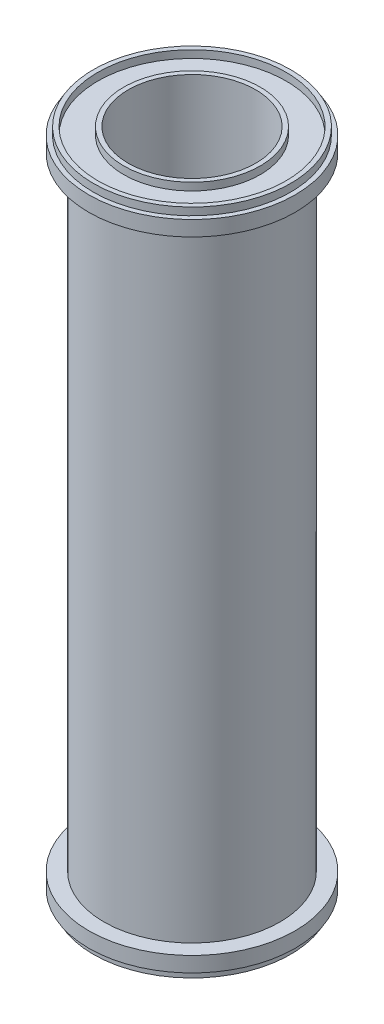
ISO-10303-21;
HEADER;
FILE_DESCRIPTION(('STEP AP214'),'2;1');
FILE_NAME('part.step','',(''),(''),'','','');
FILE_SCHEMA(('AUTOMOTIVE_DESIGN { 1 0 10303 214 1 1 1 1 }'));
ENDSEC;
DATA;
#1=APPLICATION_CONTEXT('core data for automotive mechanical design processes');
#2=APPLICATION_PROTOCOL_DEFINITION('international standard','automotive_design',2000,#1);
#3=PRODUCT_CONTEXT('',#1,'mechanical');
#4=PRODUCT('Part','Part','',(#3));
#5=PRODUCT_RELATED_PRODUCT_CATEGORY('part','',(#4));
#6=PRODUCT_DEFINITION_FORMATION('','',#4);
#7=PRODUCT_DEFINITION_CONTEXT('part definition',#1,'design');
#8=PRODUCT_DEFINITION('design','',#6,#7);
#9=PRODUCT_DEFINITION_SHAPE('','',#8);
#10=(LENGTH_UNIT() NAMED_UNIT(*) SI_UNIT(.MILLI.,.METRE.));
#11=(NAMED_UNIT(*) PLANE_ANGLE_UNIT() SI_UNIT($,.RADIAN.));
#12=(NAMED_UNIT(*) SI_UNIT($,.STERADIAN.) SOLID_ANGLE_UNIT());
#13=UNCERTAINTY_MEASURE_WITH_UNIT(LENGTH_MEASURE(1.E-05),#10,'distance_accuracy_value','');
#14=(GEOMETRIC_REPRESENTATION_CONTEXT(3) GLOBAL_UNCERTAINTY_ASSIGNED_CONTEXT((#13)) GLOBAL_UNIT_ASSIGNED_CONTEXT((#10,
#11,#12)) REPRESENTATION_CONTEXT('',''));
#15=CARTESIAN_POINT('',(0.,0.,0.));
#16=DIRECTION('',(0.,0.,1.));
#17=DIRECTION('',(1.,0.,0.));
#18=AXIS2_PLACEMENT_3D('',#15,#16,#17);
#19=CARTESIAN_POINT('',(0.,0.,0.));
#20=DIRECTION('',(0.,1.,0.));
#21=DIRECTION('',(0.,0.,1.));
#22=AXIS2_PLACEMENT_3D('',#19,#20,#21);
#23=CYLINDRICAL_SURFACE('',#22,4.2);
#24=CARTESIAN_POINT('',(0.,22.,0.));
#25=DIRECTION('',(0.,1.,0.));
#26=DIRECTION('',(0.,0.,1.));
#27=AXIS2_PLACEMENT_3D('',#24,#25,#26);
#28=CIRCLE('',#27,4.2);
#29=CARTESIAN_POINT('',(0.,22.,4.2));
#30=VERTEX_POINT('',#29);
#31=EDGE_CURVE('E95',#30,#30,#28,.T.);
#32=ORIENTED_EDGE('',*,*,#31,.T.);
#33=EDGE_LOOP('',(#32));
#34=FACE_BOUND('',#33,.T.);
#35=CARTESIAN_POINT('',(0.,-22.,0.));
#36=DIRECTION('',(0.,1.,0.));
#37=DIRECTION('',(0.,0.,1.));
#38=AXIS2_PLACEMENT_3D('',#35,#36,#37);
#39=CIRCLE('',#38,4.2);
#40=CARTESIAN_POINT('',(0.,-22.,4.2));
#41=VERTEX_POINT('',#40);
#42=EDGE_CURVE('E10',#41,#41,#39,.T.);
#43=ORIENTED_EDGE('',*,*,#42,.F.);
#44=EDGE_LOOP('',(#43));
#45=FACE_BOUND('',#44,.T.);
#46=ADVANCED_FACE('F31',(#34,#45),#23,.F.);
#47=CARTESIAN_POINT('',(0.,-22.,4.5));
#48=DIRECTION('',(0.,-1.,0.));
#49=DIRECTION('',(0.,0.,-1.));
#50=AXIS2_PLACEMENT_3D('',#47,#48,#49);
#51=PLANE('',#50);
#52=ORIENTED_EDGE('',*,*,#42,.T.);
#53=EDGE_LOOP('',(#52));
#54=FACE_BOUND('',#53,.T.);
#55=CARTESIAN_POINT('',(0.,-22.,0.));
#56=DIRECTION('',(0.,1.,0.));
#57=DIRECTION('',(0.,0.,1.));
#58=AXIS2_PLACEMENT_3D('',#55,#56,#57);
#59=CIRCLE('',#58,4.5);
#60=CARTESIAN_POINT('',(0.,-22.,4.5));
#61=VERTEX_POINT('',#60);
#62=EDGE_CURVE('E37',#61,#61,#59,.T.);
#63=ORIENTED_EDGE('',*,*,#62,.F.);
#64=EDGE_LOOP('',(#63));
#65=FACE_BOUND('',#64,.T.);
#66=ADVANCED_FACE('F113',(#54,#65),#51,.T.);
#67=CARTESIAN_POINT('',(0.,0.,0.));
#68=DIRECTION('',(0.,1.,0.));
#69=DIRECTION('',(0.,0.,1.));
#70=AXIS2_PLACEMENT_3D('',#67,#68,#69);
#71=CYLINDRICAL_SURFACE('',#70,4.5);
#72=ORIENTED_EDGE('',*,*,#62,.T.);
#73=EDGE_LOOP('',(#72));
#74=FACE_BOUND('',#73,.T.);
#75=CARTESIAN_POINT('',(0.,-21.5,0.));
#76=DIRECTION('',(0.,1.,0.));
#77=DIRECTION('',(0.,0.,1.));
#78=AXIS2_PLACEMENT_3D('',#75,#76,#77);
#79=CIRCLE('',#78,4.5);
#80=CARTESIAN_POINT('',(0.,-21.5,4.5));
#81=VERTEX_POINT('',#80);
#82=EDGE_CURVE('E41',#81,#81,#79,.T.);
#83=ORIENTED_EDGE('',*,*,#82,.F.);
#84=EDGE_LOOP('',(#83));
#85=FACE_BOUND('',#84,.T.);
#86=ADVANCED_FACE('F117',(#74,#85),#71,.T.);
#87=CARTESIAN_POINT('',(0.,-21.5,6.2));
#88=DIRECTION('',(0.,-1.,0.));
#89=DIRECTION('',(0.,0.,-1.));
#90=AXIS2_PLACEMENT_3D('',#87,#88,#89);
#91=PLANE('',#90);
#92=ORIENTED_EDGE('',*,*,#82,.T.);
#93=EDGE_LOOP('',(#92));
#94=FACE_BOUND('',#93,.T.);
#95=CARTESIAN_POINT('',(0.,-21.5,0.));
#96=DIRECTION('',(0.,1.,0.));
#97=DIRECTION('',(0.,0.,1.));
#98=AXIS2_PLACEMENT_3D('',#95,#96,#97);
#99=CIRCLE('',#98,6.2);
#100=CARTESIAN_POINT('',(0.,-21.5,6.2));
#101=VERTEX_POINT('',#100);
#102=EDGE_CURVE('E45',#101,#101,#99,.T.);
#103=ORIENTED_EDGE('',*,*,#102,.F.);
#104=EDGE_LOOP('',(#103));
#105=FACE_BOUND('',#104,.T.);
#106=ADVANCED_FACE('F121',(#94,#105),#91,.T.);
#107=CARTESIAN_POINT('',(0.,0.,0.));
#108=DIRECTION('',(0.,1.,0.));
#109=DIRECTION('',(0.,0.,1.));
#110=AXIS2_PLACEMENT_3D('',#107,#108,#109);
#111=CYLINDRICAL_SURFACE('',#110,6.2);
#112=ORIENTED_EDGE('',*,*,#102,.T.);
#113=EDGE_LOOP('',(#112));
#114=FACE_BOUND('',#113,.T.);
#115=CARTESIAN_POINT('',(0.,-22.,0.));
#116=DIRECTION('',(0.,1.,0.));
#117=DIRECTION('',(0.,0.,1.));
#118=AXIS2_PLACEMENT_3D('',#115,#116,#117);
#119=CIRCLE('',#118,6.2);
#120=CARTESIAN_POINT('',(0.,-22.,6.2));
#121=VERTEX_POINT('',#120);
#122=EDGE_CURVE('E50',#121,#121,#119,.T.);
#123=ORIENTED_EDGE('',*,*,#122,.F.);
#124=EDGE_LOOP('',(#123));
#125=FACE_BOUND('',#124,.T.);
#126=ADVANCED_FACE('F127',(#114,#125),#111,.F.);
#127=CARTESIAN_POINT('',(0.,-22.,6.50000000000001));
#128=DIRECTION('',(0.,-1.,0.));
#129=DIRECTION('',(0.,0.,-1.));
#130=AXIS2_PLACEMENT_3D('',#127,#128,#129);
#131=PLANE('',#130);
#132=ORIENTED_EDGE('',*,*,#122,.T.);
#133=EDGE_LOOP('',(#132));
#134=FACE_BOUND('',#133,.T.);
#135=CARTESIAN_POINT('',(0.,-22.,0.));
#136=DIRECTION('',(0.,1.,0.));
#137=DIRECTION('',(0.,0.,1.));
#138=AXIS2_PLACEMENT_3D('',#135,#136,#137);
#139=CIRCLE('',#138,6.5);
#140=CARTESIAN_POINT('',(0.,-22.,6.50000000000001));
#141=VERTEX_POINT('',#140);
#142=EDGE_CURVE('E53',#141,#141,#139,.T.);
#143=ORIENTED_EDGE('',*,*,#142,.F.);
#144=EDGE_LOOP('',(#143));
#145=FACE_BOUND('',#144,.T.);
#146=ADVANCED_FACE('F131',(#134,#145),#131,.T.);
#147=CARTESIAN_POINT('',(0.,0.,0.));
#148=DIRECTION('',(0.,1.,0.));
#149=DIRECTION('',(0.,0.,1.));
#150=AXIS2_PLACEMENT_3D('',#147,#148,#149);
#151=CYLINDRICAL_SURFACE('',#150,6.5);
#152=ORIENTED_EDGE('',*,*,#142,.T.);
#153=EDGE_LOOP('',(#152));
#154=FACE_BOUND('',#153,.T.);
#155=CARTESIAN_POINT('',(0.,-21.5,0.));
#156=DIRECTION('',(0.,1.,0.));
#157=DIRECTION('',(0.,0.,1.));
#158=AXIS2_PLACEMENT_3D('',#155,#156,#157);
#159=CIRCLE('',#158,6.5);
#160=CARTESIAN_POINT('',(0.,-21.5,6.50000000000001));
#161=VERTEX_POINT('',#160);
#162=EDGE_CURVE('E56',#161,#161,#159,.T.);
#163=ORIENTED_EDGE('',*,*,#162,.F.);
#164=EDGE_LOOP('',(#163));
#165=FACE_BOUND('',#164,.T.);
#166=ADVANCED_FACE('F135',(#154,#165),#151,.T.);
#167=CARTESIAN_POINT('',(0.,-21.5,6.8000000000001));
#168=DIRECTION('',(0.,-1.,0.));
#169=DIRECTION('',(0.,0.,-1.));
#170=AXIS2_PLACEMENT_3D('',#167,#168,#169);
#171=PLANE('',#170);
#172=ORIENTED_EDGE('',*,*,#162,.T.);
#173=EDGE_LOOP('',(#172));
#174=FACE_BOUND('',#173,.T.);
#175=CARTESIAN_POINT('',(0.,-21.5,0.));
#176=DIRECTION('',(0.,1.,0.));
#177=DIRECTION('',(0.,0.,1.));
#178=AXIS2_PLACEMENT_3D('',#175,#176,#177);
#179=CIRCLE('',#178,6.8000000000001);
#180=CARTESIAN_POINT('',(0.,-21.5,6.8000000000001));
#181=VERTEX_POINT('',#180);
#182=EDGE_CURVE('E59',#181,#181,#179,.T.);
#183=ORIENTED_EDGE('',*,*,#182,.F.);
#184=EDGE_LOOP('',(#183));
#185=FACE_BOUND('',#184,.T.);
#186=ADVANCED_FACE('F139',(#174,#185),#171,.T.);
#187=CARTESIAN_POINT('',(0.,0.,0.));
#188=DIRECTION('',(0.,1.,0.));
#189=DIRECTION('',(0.,0.,1.));
#190=AXIS2_PLACEMENT_3D('',#187,#188,#189);
#191=CYLINDRICAL_SURFACE('',#190,6.8000000000001);
#192=ORIENTED_EDGE('',*,*,#182,.T.);
#193=EDGE_LOOP('',(#192));
#194=FACE_BOUND('',#193,.T.);
#195=CARTESIAN_POINT('',(0.,-20.5,0.));
#196=DIRECTION('',(0.,1.,0.));
#197=DIRECTION('',(0.,0.,1.));
#198=AXIS2_PLACEMENT_3D('',#195,#196,#197);
#199=CIRCLE('',#198,6.8000000000001);
#200=CARTESIAN_POINT('',(0.,-20.5,6.8000000000001));
#201=VERTEX_POINT('',#200);
#202=EDGE_CURVE('E62',#201,#201,#199,.T.);
#203=ORIENTED_EDGE('',*,*,#202,.F.);
#204=EDGE_LOOP('',(#203));
#205=FACE_BOUND('',#204,.T.);
#206=ADVANCED_FACE('F143',(#194,#205),#191,.T.);
#207=CARTESIAN_POINT('',(0.,-20.5,5.7999999999999));
#208=DIRECTION('',(0.,1.,0.));
#209=DIRECTION('',(0.,0.,1.));
#210=AXIS2_PLACEMENT_3D('',#207,#208,#209);
#211=PLANE('',#210);
#212=ORIENTED_EDGE('',*,*,#202,.T.);
#213=EDGE_LOOP('',(#212));
#214=FACE_BOUND('',#213,.T.);
#215=CARTESIAN_POINT('',(0.,-20.5,0.));
#216=DIRECTION('',(0.,1.,0.));
#217=DIRECTION('',(0.,0.,1.));
#218=AXIS2_PLACEMENT_3D('',#215,#216,#217);
#219=CIRCLE('',#218,5.7999999999999);
#220=CARTESIAN_POINT('',(0.,-20.5,5.7999999999999));
#221=VERTEX_POINT('',#220);
#222=EDGE_CURVE('E65',#221,#221,#219,.T.);
#223=ORIENTED_EDGE('',*,*,#222,.F.);
#224=EDGE_LOOP('',(#223));
#225=FACE_BOUND('',#224,.T.);
#226=ADVANCED_FACE('F147',(#214,#225),#211,.T.);
#227=CARTESIAN_POINT('',(0.,0.,0.));
#228=DIRECTION('',(0.,1.,0.));
#229=DIRECTION('',(0.,0.,1.));
#230=AXIS2_PLACEMENT_3D('',#227,#228,#229);
#231=CYLINDRICAL_SURFACE('',#230,5.7999999999999);
#232=ORIENTED_EDGE('',*,*,#222,.T.);
#233=EDGE_LOOP('',(#232));
#234=FACE_BOUND('',#233,.T.);
#235=CARTESIAN_POINT('',(0.,20.5,0.));
#236=DIRECTION('',(0.,1.,0.));
#237=DIRECTION('',(0.,0.,1.));
#238=AXIS2_PLACEMENT_3D('',#235,#236,#237);
#239=CIRCLE('',#238,5.7999999999999);
#240=CARTESIAN_POINT('',(0.,20.5,5.7999999999999));
#241=VERTEX_POINT('',#240);
#242=EDGE_CURVE('E68',#241,#241,#239,.T.);
#243=ORIENTED_EDGE('',*,*,#242,.F.);
#244=EDGE_LOOP('',(#243));
#245=FACE_BOUND('',#244,.T.);
#246=ADVANCED_FACE('F151',(#234,#245),#231,.T.);
#247=CARTESIAN_POINT('',(0.,20.5,5.7999999999999));
#248=DIRECTION('',(0.,-1.,0.));
#249=DIRECTION('',(0.,0.,-1.));
#250=AXIS2_PLACEMENT_3D('',#247,#248,#249);
#251=PLANE('',#250);
#252=ORIENTED_EDGE('',*,*,#242,.T.);
#253=EDGE_LOOP('',(#252));
#254=FACE_BOUND('',#253,.T.);
#255=CARTESIAN_POINT('',(0.,20.5,0.));
#256=DIRECTION('',(0.,1.,0.));
#257=DIRECTION('',(0.,0.,1.));
#258=AXIS2_PLACEMENT_3D('',#255,#256,#257);
#259=CIRCLE('',#258,6.8000000000001);
#260=CARTESIAN_POINT('',(0.,20.5,6.8000000000001));
#261=VERTEX_POINT('',#260);
#262=EDGE_CURVE('E71',#261,#261,#259,.T.);
#263=ORIENTED_EDGE('',*,*,#262,.F.);
#264=EDGE_LOOP('',(#263));
#265=FACE_BOUND('',#264,.T.);
#266=ADVANCED_FACE('F155',(#254,#265),#251,.T.);
#267=CARTESIAN_POINT('',(0.,0.,0.));
#268=DIRECTION('',(0.,1.,0.));
#269=DIRECTION('',(0.,0.,1.));
#270=AXIS2_PLACEMENT_3D('',#267,#268,#269);
#271=CYLINDRICAL_SURFACE('',#270,6.8000000000001);
#272=ORIENTED_EDGE('',*,*,#262,.T.);
#273=EDGE_LOOP('',(#272));
#274=FACE_BOUND('',#273,.T.);
#275=CARTESIAN_POINT('',(0.,21.5,0.));
#276=DIRECTION('',(0.,1.,0.));
#277=DIRECTION('',(0.,0.,1.));
#278=AXIS2_PLACEMENT_3D('',#275,#276,#277);
#279=CIRCLE('',#278,6.8000000000001);
#280=CARTESIAN_POINT('',(0.,21.5,6.8000000000001));
#281=VERTEX_POINT('',#280);
#282=EDGE_CURVE('E74',#281,#281,#279,.T.);
#283=ORIENTED_EDGE('',*,*,#282,.F.);
#284=EDGE_LOOP('',(#283));
#285=FACE_BOUND('',#284,.T.);
#286=ADVANCED_FACE('F159',(#274,#285),#271,.T.);
#287=CARTESIAN_POINT('',(0.,21.5,6.8000000000001));
#288=DIRECTION('',(0.,1.,0.));
#289=DIRECTION('',(0.,0.,1.));
#290=AXIS2_PLACEMENT_3D('',#287,#288,#289);
#291=PLANE('',#290);
#292=ORIENTED_EDGE('',*,*,#282,.T.);
#293=EDGE_LOOP('',(#292));
#294=FACE_BOUND('',#293,.T.);
#295=CARTESIAN_POINT('',(0.,21.5,0.));
#296=DIRECTION('',(0.,1.,0.));
#297=DIRECTION('',(0.,0.,1.));
#298=AXIS2_PLACEMENT_3D('',#295,#296,#297);
#299=CIRCLE('',#298,6.50000000000001);
#300=CARTESIAN_POINT('',(0.,21.5,6.50000000000001));
#301=VERTEX_POINT('',#300);
#302=EDGE_CURVE('E77',#301,#301,#299,.T.);
#303=ORIENTED_EDGE('',*,*,#302,.F.);
#304=EDGE_LOOP('',(#303));
#305=FACE_BOUND('',#304,.T.);
#306=ADVANCED_FACE('F163',(#294,#305),#291,.T.);
#307=CARTESIAN_POINT('',(0.,0.,0.));
#308=DIRECTION('',(0.,1.,0.));
#309=DIRECTION('',(0.,0.,1.));
#310=AXIS2_PLACEMENT_3D('',#307,#308,#309);
#311=CYLINDRICAL_SURFACE('',#310,6.50000000000001);
#312=ORIENTED_EDGE('',*,*,#302,.T.);
#313=EDGE_LOOP('',(#312));
#314=FACE_BOUND('',#313,.T.);
#315=CARTESIAN_POINT('',(0.,22.,0.));
#316=DIRECTION('',(0.,1.,0.));
#317=DIRECTION('',(0.,0.,1.));
#318=AXIS2_PLACEMENT_3D('',#315,#316,#317);
#319=CIRCLE('',#318,6.50000000000001);
#320=CARTESIAN_POINT('',(0.,22.,6.50000000000001));
#321=VERTEX_POINT('',#320);
#322=EDGE_CURVE('E80',#321,#321,#319,.T.);
#323=ORIENTED_EDGE('',*,*,#322,.F.);
#324=EDGE_LOOP('',(#323));
#325=FACE_BOUND('',#324,.T.);
#326=ADVANCED_FACE('F167',(#314,#325),#311,.T.);
#327=CARTESIAN_POINT('',(0.,22.,6.50000000000001));
#328=DIRECTION('',(0.,1.,0.));
#329=DIRECTION('',(0.,0.,1.));
#330=AXIS2_PLACEMENT_3D('',#327,#328,#329);
#331=PLANE('',#330);
#332=ORIENTED_EDGE('',*,*,#322,.T.);
#333=EDGE_LOOP('',(#332));
#334=FACE_BOUND('',#333,.T.);
#335=CARTESIAN_POINT('',(0.,22.,0.));
#336=DIRECTION('',(0.,1.,0.));
#337=DIRECTION('',(0.,0.,1.));
#338=AXIS2_PLACEMENT_3D('',#335,#336,#337);
#339=CIRCLE('',#338,6.2);
#340=CARTESIAN_POINT('',(0.,22.,6.2));
#341=VERTEX_POINT('',#340);
#342=EDGE_CURVE('E83',#341,#341,#339,.T.);
#343=ORIENTED_EDGE('',*,*,#342,.F.);
#344=EDGE_LOOP('',(#343));
#345=FACE_BOUND('',#344,.T.);
#346=ADVANCED_FACE('F171',(#334,#345),#331,.T.);
#347=CARTESIAN_POINT('',(0.,0.,0.));
#348=DIRECTION('',(0.,1.,0.));
#349=DIRECTION('',(0.,0.,1.));
#350=AXIS2_PLACEMENT_3D('',#347,#348,#349);
#351=CYLINDRICAL_SURFACE('',#350,6.2);
#352=ORIENTED_EDGE('',*,*,#342,.T.);
#353=EDGE_LOOP('',(#352));
#354=FACE_BOUND('',#353,.T.);
#355=CARTESIAN_POINT('',(0.,21.5,0.));
#356=DIRECTION('',(0.,1.,0.));
#357=DIRECTION('',(0.,0.,1.));
#358=AXIS2_PLACEMENT_3D('',#355,#356,#357);
#359=CIRCLE('',#358,6.2);
#360=CARTESIAN_POINT('',(0.,21.5,6.2));
#361=VERTEX_POINT('',#360);
#362=EDGE_CURVE('E86',#361,#361,#359,.T.);
#363=ORIENTED_EDGE('',*,*,#362,.F.);
#364=EDGE_LOOP('',(#363));
#365=FACE_BOUND('',#364,.T.);
#366=ADVANCED_FACE('F175',(#354,#365),#351,.F.);
#367=CARTESIAN_POINT('',(0.,21.5,6.2));
#368=DIRECTION('',(0.,1.,0.));
#369=DIRECTION('',(0.,0.,1.));
#370=AXIS2_PLACEMENT_3D('',#367,#368,#369);
#371=PLANE('',#370);
#372=ORIENTED_EDGE('',*,*,#362,.T.);
#373=EDGE_LOOP('',(#372));
#374=FACE_BOUND('',#373,.T.);
#375=CARTESIAN_POINT('',(0.,21.5,0.));
#376=DIRECTION('',(0.,1.,0.));
#377=DIRECTION('',(0.,0.,1.));
#378=AXIS2_PLACEMENT_3D('',#375,#376,#377);
#379=CIRCLE('',#378,4.5);
#380=CARTESIAN_POINT('',(0.,21.5,4.5));
#381=VERTEX_POINT('',#380);
#382=EDGE_CURVE('E89',#381,#381,#379,.T.);
#383=ORIENTED_EDGE('',*,*,#382,.F.);
#384=EDGE_LOOP('',(#383));
#385=FACE_BOUND('',#384,.T.);
#386=ADVANCED_FACE('F109',(#374,#385),#371,.T.);
#387=CARTESIAN_POINT('',(0.,0.,0.));
#388=DIRECTION('',(0.,1.,0.));
#389=DIRECTION('',(0.,0.,1.));
#390=AXIS2_PLACEMENT_3D('',#387,#388,#389);
#391=CYLINDRICAL_SURFACE('',#390,4.5);
#392=ORIENTED_EDGE('',*,*,#382,.T.);
#393=EDGE_LOOP('',(#392));
#394=FACE_BOUND('',#393,.T.);
#395=CARTESIAN_POINT('',(0.,22.,0.));
#396=DIRECTION('',(0.,1.,0.));
#397=DIRECTION('',(0.,0.,1.));
#398=AXIS2_PLACEMENT_3D('',#395,#396,#397);
#399=CIRCLE('',#398,4.5);
#400=CARTESIAN_POINT('',(0.,22.,4.5));
#401=VERTEX_POINT('',#400);
#402=EDGE_CURVE('E92',#401,#401,#399,.T.);
#403=ORIENTED_EDGE('',*,*,#402,.F.);
#404=EDGE_LOOP('',(#403));
#405=FACE_BOUND('',#404,.T.);
#406=ADVANCED_FACE('F103',(#394,#405),#391,.T.);
#407=CARTESIAN_POINT('',(0.,22.,4.5));
#408=DIRECTION('',(0.,1.,0.));
#409=DIRECTION('',(0.,0.,1.));
#410=AXIS2_PLACEMENT_3D('',#407,#408,#409);
#411=PLANE('',#410);
#412=ORIENTED_EDGE('',*,*,#402,.T.);
#413=EDGE_LOOP('',(#412));
#414=FACE_BOUND('',#413,.T.);
#415=ORIENTED_EDGE('',*,*,#31,.F.);
#416=EDGE_LOOP('',(#415));
#417=FACE_BOUND('',#416,.T.);
#418=ADVANCED_FACE('F101',(#414,#417),#411,.T.);
#419=CLOSED_SHELL('',(#46,#66,#86,#106,#126,#146,#166,#186,#206,#226,#246,#266,#286,#306,#326,
#346,#366,#386,#406,#418));
#420=MANIFOLD_SOLID_BREP('B2',#419);
#421=ADVANCED_BREP_SHAPE_REPRESENTATION('',(#18,#420),#14);
#422=SHAPE_DEFINITION_REPRESENTATION(#9,#421);
ENDSEC;
END-ISO-10303-21;
